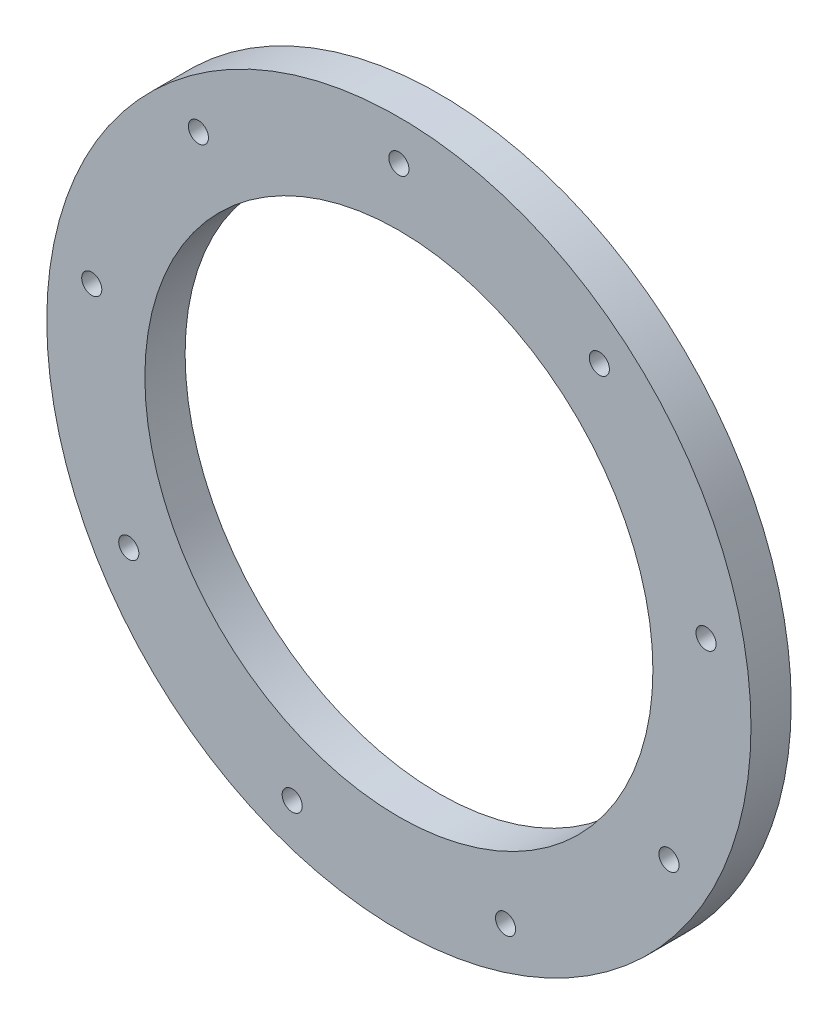
ISO-10303-21;
HEADER;
FILE_DESCRIPTION(('STEP AP214'),'2;1');
FILE_NAME('part.step','',(''),(''),'','','');
FILE_SCHEMA(('AUTOMOTIVE_DESIGN { 1 0 10303 214 1 1 1 1 }'));
ENDSEC;
DATA;
#1=APPLICATION_CONTEXT('core data for automotive mechanical design processes');
#2=APPLICATION_PROTOCOL_DEFINITION('international standard','automotive_design',2000,#1);
#3=PRODUCT_CONTEXT('',#1,'mechanical');
#4=PRODUCT('Part','Part','',(#3));
#5=PRODUCT_RELATED_PRODUCT_CATEGORY('part','',(#4));
#6=PRODUCT_DEFINITION_FORMATION('','',#4);
#7=PRODUCT_DEFINITION_CONTEXT('part definition',#1,'design');
#8=PRODUCT_DEFINITION('design','',#6,#7);
#9=PRODUCT_DEFINITION_SHAPE('','',#8);
#10=(LENGTH_UNIT() NAMED_UNIT(*) SI_UNIT(.MILLI.,.METRE.));
#11=(NAMED_UNIT(*) PLANE_ANGLE_UNIT() SI_UNIT($,.RADIAN.));
#12=(NAMED_UNIT(*) SI_UNIT($,.STERADIAN.) SOLID_ANGLE_UNIT());
#13=UNCERTAINTY_MEASURE_WITH_UNIT(LENGTH_MEASURE(1.E-05),#10,'distance_accuracy_value','');
#14=(GEOMETRIC_REPRESENTATION_CONTEXT(3) GLOBAL_UNCERTAINTY_ASSIGNED_CONTEXT((#13)) GLOBAL_UNIT_ASSIGNED_CONTEXT((#10,
#11,#12)) REPRESENTATION_CONTEXT('',''));
#15=CARTESIAN_POINT('',(0.,0.,0.));
#16=DIRECTION('',(0.,0.,1.));
#17=DIRECTION('',(1.,0.,0.));
#18=AXIS2_PLACEMENT_3D('',#15,#16,#17);
#19=CARTESIAN_POINT('',(0.,0.,8.));
#20=DIRECTION('',(0.,0.,1.));
#21=DIRECTION('',(1.,0.,0.));
#22=AXIS2_PLACEMENT_3D('',#19,#20,#21);
#23=PLANE('',#22);
#24=CARTESIAN_POINT('',(-61.0580806867568,10.7661870153503,8.));
#25=DIRECTION('',(0.,0.,1.));
#26=DIRECTION('',(1.,0.,0.));
#27=AXIS2_PLACEMENT_3D('',#24,#25,#26);
#28=CIRCLE('',#27,2.);
#29=CARTESIAN_POINT('',(-59.0580806867568,10.7661870153503,8.));
#30=VERTEX_POINT('',#29);
#31=EDGE_CURVE('E97',#30,#30,#28,.T.);
#32=ORIENTED_EDGE('',*,*,#31,.F.);
#33=EDGE_LOOP('',(#32));
#34=FACE_BOUND('',#33,.T.);
#35=CARTESIAN_POINT('',(-21.2052488861919,-58.2609424887262,8.));
#36=DIRECTION('',(0.,0.,1.));
#37=DIRECTION('',(1.,0.,0.));
#38=AXIS2_PLACEMENT_3D('',#35,#36,#37);
#39=CIRCLE('',#38,2.);
#40=CARTESIAN_POINT('',(-19.2052488861919,-58.2609424887262,8.));
#41=VERTEX_POINT('',#40);
#42=EDGE_CURVE('E85',#41,#41,#39,.T.);
#43=ORIENTED_EDGE('',*,*,#42,.F.);
#44=EDGE_LOOP('',(#43));
#45=FACE_BOUND('',#44,.T.);
#46=CARTESIAN_POINT('',(53.6935750346351,-31.0000000000003,8.));
#47=DIRECTION('',(0.,0.,1.));
#48=DIRECTION('',(1.,0.,0.));
#49=AXIS2_PLACEMENT_3D('',#46,#47,#48);
#50=CIRCLE('',#49,2.);
#51=CARTESIAN_POINT('',(55.6935750346351,-31.0000000000003,8.));
#52=VERTEX_POINT('',#51);
#53=EDGE_CURVE('E73',#52,#52,#50,.T.);
#54=ORIENTED_EDGE('',*,*,#53,.F.);
#55=EDGE_LOOP('',(#54));
#56=FACE_BOUND('',#55,.T.);
#57=CARTESIAN_POINT('',(39.8528318005655,47.4947554733766,8.));
#58=DIRECTION('',(0.,0.,1.));
#59=DIRECTION('',(1.,0.,0.));
#60=AXIS2_PLACEMENT_3D('',#57,#58,#59);
#61=CIRCLE('',#60,2.);
#62=CARTESIAN_POINT('',(41.8528318005655,47.4947554733766,8.));
#63=VERTEX_POINT('',#62);
#64=EDGE_CURVE('E61',#63,#63,#61,.T.);
#65=ORIENTED_EDGE('',*,*,#64,.F.);
#66=EDGE_LOOP('',(#65));
#67=FACE_BOUND('',#66,.T.);
#68=CARTESIAN_POINT('',(0.,0.,8.));
#69=DIRECTION('',(0.,0.,1.));
#70=DIRECTION('',(1.,0.,0.));
#71=AXIS2_PLACEMENT_3D('',#68,#69,#70);
#72=CIRCLE('',#71,50.5);
#73=CARTESIAN_POINT('',(50.5,0.,8.));
#74=VERTEX_POINT('',#73);
#75=EDGE_CURVE('E50',#74,#74,#72,.T.);
#76=ORIENTED_EDGE('',*,*,#75,.F.);
#77=EDGE_LOOP('',(#76));
#78=FACE_BOUND('',#77,.T.);
#79=CARTESIAN_POINT('',(0.,0.,8.));
#80=DIRECTION('',(0.,0.,1.));
#81=DIRECTION('',(1.,0.,0.));
#82=AXIS2_PLACEMENT_3D('',#79,#80,#81);
#83=CIRCLE('',#82,70.);
#84=CARTESIAN_POINT('',(70.,0.,8.));
#85=VERTEX_POINT('',#84);
#86=EDGE_CURVE('E10',#85,#85,#83,.T.);
#87=ORIENTED_EDGE('',*,*,#86,.T.);
#88=EDGE_LOOP('',(#87));
#89=FACE_BOUND('',#88,.T.);
#90=CARTESIAN_POINT('',(0.,62.,8.));
#91=DIRECTION('',(0.,0.,1.));
#92=DIRECTION('',(1.,0.,0.));
#93=AXIS2_PLACEMENT_3D('',#90,#91,#92);
#94=CIRCLE('',#93,2.);
#95=CARTESIAN_POINT('',(2.,62.,8.));
#96=VERTEX_POINT('',#95);
#97=EDGE_CURVE('E55',#96,#96,#94,.T.);
#98=ORIENTED_EDGE('',*,*,#97,.F.);
#99=EDGE_LOOP('',(#98));
#100=FACE_BOUND('',#99,.T.);
#101=CARTESIAN_POINT('',(61.0580806867569,10.7661870153495,8.));
#102=DIRECTION('',(0.,0.,1.));
#103=DIRECTION('',(1.,0.,0.));
#104=AXIS2_PLACEMENT_3D('',#101,#102,#103);
#105=CIRCLE('',#104,2.);
#106=CARTESIAN_POINT('',(63.0580806867569,10.7661870153495,8.));
#107=VERTEX_POINT('',#106);
#108=EDGE_CURVE('E67',#107,#107,#105,.T.);
#109=ORIENTED_EDGE('',*,*,#108,.F.);
#110=EDGE_LOOP('',(#109));
#111=FACE_BOUND('',#110,.T.);
#112=CARTESIAN_POINT('',(21.2052488861911,-58.2609424887265,8.));
#113=DIRECTION('',(0.,0.,1.));
#114=DIRECTION('',(1.,0.,0.));
#115=AXIS2_PLACEMENT_3D('',#112,#113,#114);
#116=CIRCLE('',#115,2.);
#117=CARTESIAN_POINT('',(23.2052488861911,-58.2609424887265,8.));
#118=VERTEX_POINT('',#117);
#119=EDGE_CURVE('E79',#118,#118,#116,.T.);
#120=ORIENTED_EDGE('',*,*,#119,.F.);
#121=EDGE_LOOP('',(#120));
#122=FACE_BOUND('',#121,.T.);
#123=CARTESIAN_POINT('',(-53.6935750346355,-30.9999999999995,8.));
#124=DIRECTION('',(0.,0.,1.));
#125=DIRECTION('',(1.,0.,0.));
#126=AXIS2_PLACEMENT_3D('',#123,#124,#125);
#127=CIRCLE('',#126,2.);
#128=CARTESIAN_POINT('',(-51.6935750346355,-30.9999999999995,8.));
#129=VERTEX_POINT('',#128);
#130=EDGE_CURVE('E91',#129,#129,#127,.T.);
#131=ORIENTED_EDGE('',*,*,#130,.F.);
#132=EDGE_LOOP('',(#131));
#133=FACE_BOUND('',#132,.T.);
#134=CARTESIAN_POINT('',(-39.8528318005649,47.4947554733771,8.));
#135=DIRECTION('',(0.,0.,1.));
#136=DIRECTION('',(1.,0.,0.));
#137=AXIS2_PLACEMENT_3D('',#134,#135,#136);
#138=CIRCLE('',#137,2.00000000000001);
#139=CARTESIAN_POINT('',(-37.8528318005649,47.4947554733771,8.));
#140=VERTEX_POINT('',#139);
#141=EDGE_CURVE('E103',#140,#140,#138,.T.);
#142=ORIENTED_EDGE('',*,*,#141,.F.);
#143=EDGE_LOOP('',(#142));
#144=FACE_BOUND('',#143,.T.);
#145=ADVANCED_FACE('F39',(#34,#45,#56,#67,#78,#89,#100,#111,#122,#133,#144),#23,.T.);
#146=CARTESIAN_POINT('',(0.,0.,0.));
#147=DIRECTION('',(0.,0.,1.));
#148=DIRECTION('',(1.,0.,0.));
#149=AXIS2_PLACEMENT_3D('',#146,#147,#148);
#150=PLANE('',#149);
#151=CARTESIAN_POINT('',(0.,0.,0.));
#152=DIRECTION('',(0.,0.,1.));
#153=DIRECTION('',(1.,0.,0.));
#154=AXIS2_PLACEMENT_3D('',#151,#152,#153);
#155=CIRCLE('',#154,70.);
#156=CARTESIAN_POINT('',(70.,0.,0.));
#157=VERTEX_POINT('',#156);
#158=EDGE_CURVE('E43',#157,#157,#155,.T.);
#159=ORIENTED_EDGE('',*,*,#158,.F.);
#160=EDGE_LOOP('',(#159));
#161=FACE_BOUND('',#160,.T.);
#162=CARTESIAN_POINT('',(0.,0.,0.));
#163=DIRECTION('',(0.,0.,1.));
#164=DIRECTION('',(1.,0.,0.));
#165=AXIS2_PLACEMENT_3D('',#162,#163,#164);
#166=CIRCLE('',#165,50.5);
#167=CARTESIAN_POINT('',(50.5,0.,0.));
#168=VERTEX_POINT('',#167);
#169=EDGE_CURVE('E52',#168,#168,#166,.T.);
#170=ORIENTED_EDGE('',*,*,#169,.T.);
#171=EDGE_LOOP('',(#170));
#172=FACE_BOUND('',#171,.T.);
#173=CARTESIAN_POINT('',(0.,62.,0.));
#174=DIRECTION('',(0.,0.,1.));
#175=DIRECTION('',(1.,0.,0.));
#176=AXIS2_PLACEMENT_3D('',#173,#174,#175);
#177=CIRCLE('',#176,2.);
#178=CARTESIAN_POINT('',(2.,62.,0.));
#179=VERTEX_POINT('',#178);
#180=EDGE_CURVE('E58',#179,#179,#177,.T.);
#181=ORIENTED_EDGE('',*,*,#180,.T.);
#182=EDGE_LOOP('',(#181));
#183=FACE_BOUND('',#182,.T.);
#184=CARTESIAN_POINT('',(39.8528318005655,47.4947554733766,0.));
#185=DIRECTION('',(0.,0.,1.));
#186=DIRECTION('',(1.,0.,0.));
#187=AXIS2_PLACEMENT_3D('',#184,#185,#186);
#188=CIRCLE('',#187,2.);
#189=CARTESIAN_POINT('',(41.8528318005655,47.4947554733766,0.));
#190=VERTEX_POINT('',#189);
#191=EDGE_CURVE('E64',#190,#190,#188,.T.);
#192=ORIENTED_EDGE('',*,*,#191,.T.);
#193=EDGE_LOOP('',(#192));
#194=FACE_BOUND('',#193,.T.);
#195=CARTESIAN_POINT('',(61.0580806867569,10.7661870153495,0.));
#196=DIRECTION('',(0.,0.,1.));
#197=DIRECTION('',(1.,0.,0.));
#198=AXIS2_PLACEMENT_3D('',#195,#196,#197);
#199=CIRCLE('',#198,2.);
#200=CARTESIAN_POINT('',(63.0580806867569,10.7661870153495,0.));
#201=VERTEX_POINT('',#200);
#202=EDGE_CURVE('E70',#201,#201,#199,.T.);
#203=ORIENTED_EDGE('',*,*,#202,.T.);
#204=EDGE_LOOP('',(#203));
#205=FACE_BOUND('',#204,.T.);
#206=CARTESIAN_POINT('',(53.6935750346351,-31.0000000000003,0.));
#207=DIRECTION('',(0.,0.,1.));
#208=DIRECTION('',(1.,0.,0.));
#209=AXIS2_PLACEMENT_3D('',#206,#207,#208);
#210=CIRCLE('',#209,2.);
#211=CARTESIAN_POINT('',(55.6935750346351,-31.0000000000003,0.));
#212=VERTEX_POINT('',#211);
#213=EDGE_CURVE('E76',#212,#212,#210,.T.);
#214=ORIENTED_EDGE('',*,*,#213,.T.);
#215=EDGE_LOOP('',(#214));
#216=FACE_BOUND('',#215,.T.);
#217=CARTESIAN_POINT('',(21.2052488861911,-58.2609424887265,0.));
#218=DIRECTION('',(0.,0.,1.));
#219=DIRECTION('',(1.,0.,0.));
#220=AXIS2_PLACEMENT_3D('',#217,#218,#219);
#221=CIRCLE('',#220,2.);
#222=CARTESIAN_POINT('',(23.2052488861911,-58.2609424887265,0.));
#223=VERTEX_POINT('',#222);
#224=EDGE_CURVE('E82',#223,#223,#221,.T.);
#225=ORIENTED_EDGE('',*,*,#224,.T.);
#226=EDGE_LOOP('',(#225));
#227=FACE_BOUND('',#226,.T.);
#228=CARTESIAN_POINT('',(-21.2052488861919,-58.2609424887262,0.));
#229=DIRECTION('',(0.,0.,1.));
#230=DIRECTION('',(1.,0.,0.));
#231=AXIS2_PLACEMENT_3D('',#228,#229,#230);
#232=CIRCLE('',#231,2.);
#233=CARTESIAN_POINT('',(-19.2052488861919,-58.2609424887262,0.));
#234=VERTEX_POINT('',#233);
#235=EDGE_CURVE('E88',#234,#234,#232,.T.);
#236=ORIENTED_EDGE('',*,*,#235,.T.);
#237=EDGE_LOOP('',(#236));
#238=FACE_BOUND('',#237,.T.);
#239=CARTESIAN_POINT('',(-53.6935750346355,-30.9999999999995,0.));
#240=DIRECTION('',(0.,0.,1.));
#241=DIRECTION('',(1.,0.,0.));
#242=AXIS2_PLACEMENT_3D('',#239,#240,#241);
#243=CIRCLE('',#242,2.);
#244=CARTESIAN_POINT('',(-51.6935750346355,-30.9999999999995,0.));
#245=VERTEX_POINT('',#244);
#246=EDGE_CURVE('E94',#245,#245,#243,.T.);
#247=ORIENTED_EDGE('',*,*,#246,.T.);
#248=EDGE_LOOP('',(#247));
#249=FACE_BOUND('',#248,.T.);
#250=CARTESIAN_POINT('',(-61.0580806867568,10.7661870153503,0.));
#251=DIRECTION('',(0.,0.,1.));
#252=DIRECTION('',(1.,0.,0.));
#253=AXIS2_PLACEMENT_3D('',#250,#251,#252);
#254=CIRCLE('',#253,2.);
#255=CARTESIAN_POINT('',(-59.0580806867568,10.7661870153503,0.));
#256=VERTEX_POINT('',#255);
#257=EDGE_CURVE('E100',#256,#256,#254,.T.);
#258=ORIENTED_EDGE('',*,*,#257,.T.);
#259=EDGE_LOOP('',(#258));
#260=FACE_BOUND('',#259,.T.);
#261=CARTESIAN_POINT('',(-39.8528318005649,47.4947554733771,0.));
#262=DIRECTION('',(0.,0.,1.));
#263=DIRECTION('',(1.,0.,0.));
#264=AXIS2_PLACEMENT_3D('',#261,#262,#263);
#265=CIRCLE('',#264,2.00000000000001);
#266=CARTESIAN_POINT('',(-37.8528318005649,47.4947554733771,0.));
#267=VERTEX_POINT('',#266);
#268=EDGE_CURVE('E106',#267,#267,#265,.T.);
#269=ORIENTED_EDGE('',*,*,#268,.T.);
#270=EDGE_LOOP('',(#269));
#271=FACE_BOUND('',#270,.T.);
#272=ADVANCED_FACE('F116',(#161,#172,#183,#194,#205,#216,#227,#238,#249,#260,#271),#150,.F.);
#273=CARTESIAN_POINT('',(0.,0.,8.));
#274=DIRECTION('',(0.,0.,-1.));
#275=DIRECTION('',(-1.,0.,0.));
#276=AXIS2_PLACEMENT_3D('',#273,#274,#275);
#277=CYLINDRICAL_SURFACE('',#276,70.);
#278=ORIENTED_EDGE('',*,*,#86,.F.);
#279=EDGE_LOOP('',(#278));
#280=FACE_BOUND('',#279,.T.);
#281=ORIENTED_EDGE('',*,*,#158,.T.);
#282=EDGE_LOOP('',(#281));
#283=FACE_BOUND('',#282,.T.);
#284=ADVANCED_FACE('F41',(#280,#283),#277,.T.);
#285=CARTESIAN_POINT('',(0.,0.,8.));
#286=DIRECTION('',(0.,0.,-1.));
#287=DIRECTION('',(-1.,0.,0.));
#288=AXIS2_PLACEMENT_3D('',#285,#286,#287);
#289=CYLINDRICAL_SURFACE('',#288,50.5);
#290=ORIENTED_EDGE('',*,*,#75,.T.);
#291=EDGE_LOOP('',(#290));
#292=FACE_BOUND('',#291,.T.);
#293=ORIENTED_EDGE('',*,*,#169,.F.);
#294=EDGE_LOOP('',(#293));
#295=FACE_BOUND('',#294,.T.);
#296=ADVANCED_FACE('F126',(#292,#295),#289,.F.);
#297=CARTESIAN_POINT('',(0.,62.,8.));
#298=DIRECTION('',(0.,0.,-1.));
#299=DIRECTION('',(-1.,0.,0.));
#300=AXIS2_PLACEMENT_3D('',#297,#298,#299);
#301=CYLINDRICAL_SURFACE('',#300,2.);
#302=ORIENTED_EDGE('',*,*,#97,.T.);
#303=EDGE_LOOP('',(#302));
#304=FACE_BOUND('',#303,.T.);
#305=ORIENTED_EDGE('',*,*,#180,.F.);
#306=EDGE_LOOP('',(#305));
#307=FACE_BOUND('',#306,.T.);
#308=ADVANCED_FACE('F129',(#304,#307),#301,.F.);
#309=CARTESIAN_POINT('',(39.8528318005655,47.4947554733766,8.));
#310=DIRECTION('',(0.,0.,-1.));
#311=DIRECTION('',(-1.,0.,0.));
#312=AXIS2_PLACEMENT_3D('',#309,#310,#311);
#313=CYLINDRICAL_SURFACE('',#312,2.);
#314=ORIENTED_EDGE('',*,*,#64,.T.);
#315=EDGE_LOOP('',(#314));
#316=FACE_BOUND('',#315,.T.);
#317=ORIENTED_EDGE('',*,*,#191,.F.);
#318=EDGE_LOOP('',(#317));
#319=FACE_BOUND('',#318,.T.);
#320=ADVANCED_FACE('F133',(#316,#319),#313,.F.);
#321=CARTESIAN_POINT('',(61.0580806867569,10.7661870153495,8.));
#322=DIRECTION('',(0.,0.,-1.));
#323=DIRECTION('',(-1.,0.,0.));
#324=AXIS2_PLACEMENT_3D('',#321,#322,#323);
#325=CYLINDRICAL_SURFACE('',#324,2.);
#326=ORIENTED_EDGE('',*,*,#108,.T.);
#327=EDGE_LOOP('',(#326));
#328=FACE_BOUND('',#327,.T.);
#329=ORIENTED_EDGE('',*,*,#202,.F.);
#330=EDGE_LOOP('',(#329));
#331=FACE_BOUND('',#330,.T.);
#332=ADVANCED_FACE('F137',(#328,#331),#325,.F.);
#333=CARTESIAN_POINT('',(53.6935750346351,-31.0000000000003,8.));
#334=DIRECTION('',(0.,0.,-1.));
#335=DIRECTION('',(-1.,0.,0.));
#336=AXIS2_PLACEMENT_3D('',#333,#334,#335);
#337=CYLINDRICAL_SURFACE('',#336,2.);
#338=ORIENTED_EDGE('',*,*,#53,.T.);
#339=EDGE_LOOP('',(#338));
#340=FACE_BOUND('',#339,.T.);
#341=ORIENTED_EDGE('',*,*,#213,.F.);
#342=EDGE_LOOP('',(#341));
#343=FACE_BOUND('',#342,.T.);
#344=ADVANCED_FACE('F141',(#340,#343),#337,.F.);
#345=CARTESIAN_POINT('',(21.2052488861911,-58.2609424887265,8.));
#346=DIRECTION('',(0.,0.,-1.));
#347=DIRECTION('',(-1.,0.,0.));
#348=AXIS2_PLACEMENT_3D('',#345,#346,#347);
#349=CYLINDRICAL_SURFACE('',#348,2.);
#350=ORIENTED_EDGE('',*,*,#119,.T.);
#351=EDGE_LOOP('',(#350));
#352=FACE_BOUND('',#351,.T.);
#353=ORIENTED_EDGE('',*,*,#224,.F.);
#354=EDGE_LOOP('',(#353));
#355=FACE_BOUND('',#354,.T.);
#356=ADVANCED_FACE('F145',(#352,#355),#349,.F.);
#357=CARTESIAN_POINT('',(-21.2052488861919,-58.2609424887262,8.));
#358=DIRECTION('',(0.,0.,-1.));
#359=DIRECTION('',(-1.,0.,0.));
#360=AXIS2_PLACEMENT_3D('',#357,#358,#359);
#361=CYLINDRICAL_SURFACE('',#360,2.);
#362=ORIENTED_EDGE('',*,*,#42,.T.);
#363=EDGE_LOOP('',(#362));
#364=FACE_BOUND('',#363,.T.);
#365=ORIENTED_EDGE('',*,*,#235,.F.);
#366=EDGE_LOOP('',(#365));
#367=FACE_BOUND('',#366,.T.);
#368=ADVANCED_FACE('F149',(#364,#367),#361,.F.);
#369=CARTESIAN_POINT('',(-53.6935750346355,-30.9999999999995,8.));
#370=DIRECTION('',(0.,0.,-1.));
#371=DIRECTION('',(-1.,0.,0.));
#372=AXIS2_PLACEMENT_3D('',#369,#370,#371);
#373=CYLINDRICAL_SURFACE('',#372,2.);
#374=ORIENTED_EDGE('',*,*,#130,.T.);
#375=EDGE_LOOP('',(#374));
#376=FACE_BOUND('',#375,.T.);
#377=ORIENTED_EDGE('',*,*,#246,.F.);
#378=EDGE_LOOP('',(#377));
#379=FACE_BOUND('',#378,.T.);
#380=ADVANCED_FACE('F153',(#376,#379),#373,.F.);
#381=CARTESIAN_POINT('',(-61.0580806867568,10.7661870153503,8.));
#382=DIRECTION('',(0.,0.,-1.));
#383=DIRECTION('',(-1.,0.,0.));
#384=AXIS2_PLACEMENT_3D('',#381,#382,#383);
#385=CYLINDRICAL_SURFACE('',#384,2.);
#386=ORIENTED_EDGE('',*,*,#31,.T.);
#387=EDGE_LOOP('',(#386));
#388=FACE_BOUND('',#387,.T.);
#389=ORIENTED_EDGE('',*,*,#257,.F.);
#390=EDGE_LOOP('',(#389));
#391=FACE_BOUND('',#390,.T.);
#392=ADVANCED_FACE('F157',(#388,#391),#385,.F.);
#393=CARTESIAN_POINT('',(-39.8528318005649,47.4947554733771,8.));
#394=DIRECTION('',(0.,0.,-1.));
#395=DIRECTION('',(-1.,0.,0.));
#396=AXIS2_PLACEMENT_3D('',#393,#394,#395);
#397=CYLINDRICAL_SURFACE('',#396,2.00000000000001);
#398=ORIENTED_EDGE('',*,*,#141,.T.);
#399=EDGE_LOOP('',(#398));
#400=FACE_BOUND('',#399,.T.);
#401=ORIENTED_EDGE('',*,*,#268,.F.);
#402=EDGE_LOOP('',(#401));
#403=FACE_BOUND('',#402,.T.);
#404=ADVANCED_FACE('F112',(#400,#403),#397,.F.);
#405=CLOSED_SHELL('',(#145,#272,#284,#296,#308,#320,#332,#344,#356,#368,#380,#392,#404));
#406=MANIFOLD_SOLID_BREP('B2',#405);
#407=ADVANCED_BREP_SHAPE_REPRESENTATION('',(#18,#406),#14);
#408=SHAPE_DEFINITION_REPRESENTATION(#9,#407);
ENDSEC;
END-ISO-10303-21;
